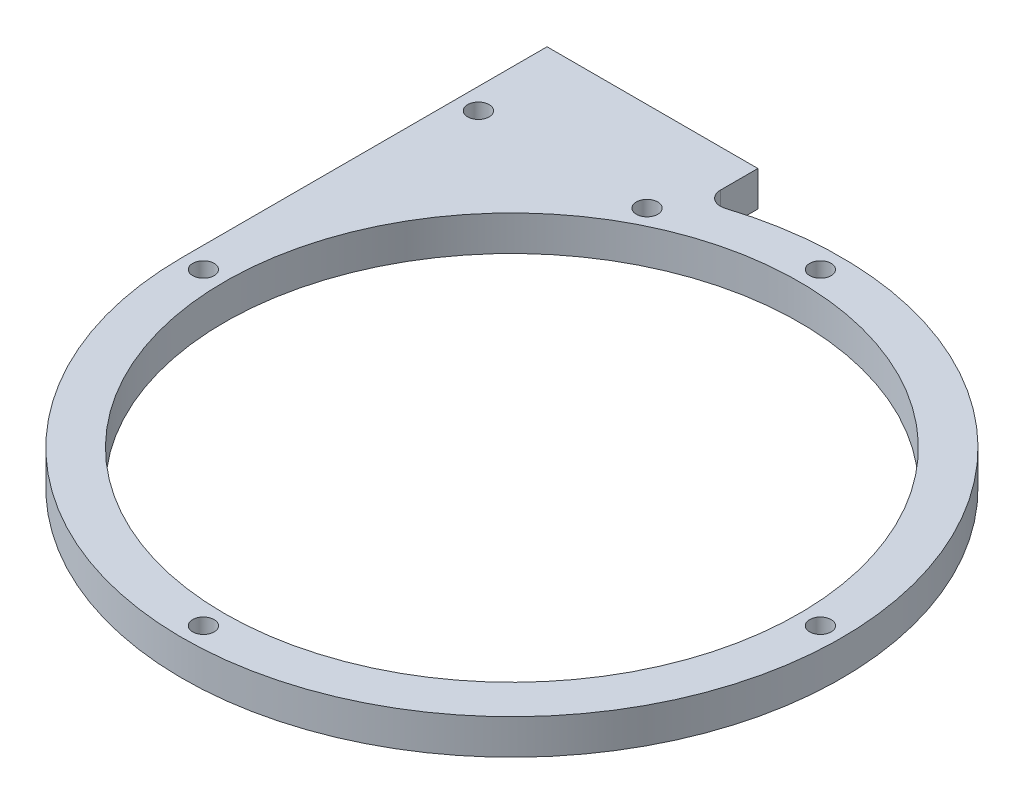
ISO-10303-21;
HEADER;
FILE_DESCRIPTION(('STEP AP214'),'2;1');
FILE_NAME('part.step','',(''),(''),'','','');
FILE_SCHEMA(('AUTOMOTIVE_DESIGN { 1 0 10303 214 1 1 1 1 }'));
ENDSEC;
DATA;
#1=APPLICATION_CONTEXT('core data for automotive mechanical design processes');
#2=APPLICATION_PROTOCOL_DEFINITION('international standard','automotive_design',2000,#1);
#3=PRODUCT_CONTEXT('',#1,'mechanical');
#4=PRODUCT('Part','Part','',(#3));
#5=PRODUCT_RELATED_PRODUCT_CATEGORY('part','',(#4));
#6=PRODUCT_DEFINITION_FORMATION('','',#4);
#7=PRODUCT_DEFINITION_CONTEXT('part definition',#1,'design');
#8=PRODUCT_DEFINITION('design','',#6,#7);
#9=PRODUCT_DEFINITION_SHAPE('','',#8);
#10=(LENGTH_UNIT() NAMED_UNIT(*) SI_UNIT(.MILLI.,.METRE.));
#11=(NAMED_UNIT(*) PLANE_ANGLE_UNIT() SI_UNIT($,.RADIAN.));
#12=(NAMED_UNIT(*) SI_UNIT($,.STERADIAN.) SOLID_ANGLE_UNIT());
#13=UNCERTAINTY_MEASURE_WITH_UNIT(LENGTH_MEASURE(1.E-05),#10,'distance_accuracy_value','');
#14=(GEOMETRIC_REPRESENTATION_CONTEXT(3) GLOBAL_UNCERTAINTY_ASSIGNED_CONTEXT((#13)) GLOBAL_UNIT_ASSIGNED_CONTEXT((#10,
#11,#12)) REPRESENTATION_CONTEXT('',''));
#15=CARTESIAN_POINT('',(0.,0.,0.));
#16=DIRECTION('',(0.,0.,1.));
#17=DIRECTION('',(1.,0.,0.));
#18=AXIS2_PLACEMENT_3D('',#15,#16,#17);
#19=CARTESIAN_POINT('',(0.,5.,0.));
#20=DIRECTION('',(0.,1.,0.));
#21=DIRECTION('',(0.,0.,1.));
#22=AXIS2_PLACEMENT_3D('',#19,#20,#21);
#23=PLANE('',#22);
#24=CARTESIAN_POINT('',(-43.9,5.,0.));
#25=DIRECTION('',(0.,1.,0.));
#26=DIRECTION('',(0.,0.,1.));
#27=AXIS2_PLACEMENT_3D('',#24,#25,#26);
#28=CIRCLE('',#27,1.525);
#29=CARTESIAN_POINT('',(-43.9,5.,1.525));
#30=VERTEX_POINT('',#29);
#31=EDGE_CURVE('E122',#30,#30,#28,.T.);
#32=ORIENTED_EDGE('',*,*,#31,.F.);
#33=EDGE_LOOP('',(#32));
#34=FACE_BOUND('',#33,.T.);
#35=CARTESIAN_POINT('',(43.9,5.,0.));
#36=DIRECTION('',(0.,1.,0.));
#37=DIRECTION('',(0.,0.,1.));
#38=AXIS2_PLACEMENT_3D('',#35,#36,#37);
#39=CIRCLE('',#38,1.525);
#40=CARTESIAN_POINT('',(43.9,5.,1.52500000000001));
#41=VERTEX_POINT('',#40);
#42=EDGE_CURVE('E135',#41,#41,#39,.T.);
#43=ORIENTED_EDGE('',*,*,#42,.F.);
#44=EDGE_LOOP('',(#43));
#45=FACE_BOUND('',#44,.T.);
#46=CARTESIAN_POINT('',(-19.9,5.,-39.1305507244659));
#47=DIRECTION('',(0.,1.,0.));
#48=DIRECTION('',(0.,0.,1.));
#49=AXIS2_PLACEMENT_3D('',#46,#47,#48);
#50=CIRCLE('',#49,1.525);
#51=CARTESIAN_POINT('',(-19.9,5.,-37.6055507244659));
#52=VERTEX_POINT('',#51);
#53=EDGE_CURVE('E143',#52,#52,#50,.T.);
#54=ORIENTED_EDGE('',*,*,#53,.F.);
#55=EDGE_LOOP('',(#54));
#56=FACE_BOUND('',#55,.T.);
#57=CARTESIAN_POINT('',(0.,5.,0.));
#58=DIRECTION('',(0.,1.,0.));
#59=DIRECTION('',(0.,0.,1.));
#60=AXIS2_PLACEMENT_3D('',#57,#58,#59);
#61=CIRCLE('',#60,46.9);
#62=CARTESIAN_POINT('',(-46.9,5.,0.));
#63=VERTEX_POINT('',#62);
#64=CARTESIAN_POINT('',(-14.2905930470348,5.,-44.6697766992856));
#65=VERTEX_POINT('',#64);
#66=EDGE_CURVE('E159',#63,#65,#61,.T.);
#67=ORIENTED_EDGE('',*,*,#66,.T.);
#68=CARTESIAN_POINT('',(-14.9,5.,-46.5746712280398));
#69=DIRECTION('',(0.,-1.,0.));
#70=DIRECTION('',(0.,0.,1.));
#71=AXIS2_PLACEMENT_3D('',#68,#69,#70);
#72=CIRCLE('',#71,2.00000000000001);
#73=CARTESIAN_POINT('',(-16.9,5.,-46.5746712280398));
#74=VERTEX_POINT('',#73);
#75=EDGE_CURVE('E79',#65,#74,#72,.T.);
#76=ORIENTED_EDGE('',*,*,#75,.T.);
#77=DIRECTION('',(0.,0.,-1.));
#78=VECTOR('',#77,1.);
#79=CARTESIAN_POINT('',(-16.9,5.,-46.9));
#80=LINE('',#79,#78);
#81=CARTESIAN_POINT('',(-16.9,5.,-51.9));
#82=VERTEX_POINT('',#81);
#83=EDGE_CURVE('E87',#74,#82,#80,.T.);
#84=ORIENTED_EDGE('',*,*,#83,.T.);
#85=DIRECTION('',(-1.,0.,0.));
#86=VECTOR('',#85,1.);
#87=CARTESIAN_POINT('',(-46.9,5.,-51.9));
#88=LINE('',#87,#86);
#89=CARTESIAN_POINT('',(-46.9,5.,-51.9));
#90=VERTEX_POINT('',#89);
#91=EDGE_CURVE('E95',#82,#90,#88,.T.);
#92=ORIENTED_EDGE('',*,*,#91,.T.);
#93=DIRECTION('',(0.,0.,1.));
#94=VECTOR('',#93,1.);
#95=CARTESIAN_POINT('',(-46.9,5.,0.));
#96=LINE('',#95,#94);
#97=EDGE_CURVE('E57',#90,#63,#96,.T.);
#98=ORIENTED_EDGE('',*,*,#97,.T.);
#99=EDGE_LOOP('',(#67,#76,#84,#92,#98));
#100=FACE_BOUND('',#99,.T.);
#101=CARTESIAN_POINT('',(0.,5.,0.));
#102=DIRECTION('',(0.,1.,0.));
#103=DIRECTION('',(0.,0.,1.));
#104=AXIS2_PLACEMENT_3D('',#101,#102,#103);
#105=CIRCLE('',#104,40.9);
#106=CARTESIAN_POINT('',(0.,5.,40.9));
#107=VERTEX_POINT('',#106);
#108=EDGE_CURVE('E154',#107,#107,#105,.T.);
#109=ORIENTED_EDGE('',*,*,#108,.F.);
#110=EDGE_LOOP('',(#109));
#111=FACE_BOUND('',#110,.T.);
#112=CARTESIAN_POINT('',(0.,5.,-43.9));
#113=DIRECTION('',(0.,1.,0.));
#114=DIRECTION('',(0.,0.,1.));
#115=AXIS2_PLACEMENT_3D('',#112,#113,#114);
#116=CIRCLE('',#115,1.525);
#117=CARTESIAN_POINT('',(0.,5.,-42.375));
#118=VERTEX_POINT('',#117);
#119=EDGE_CURVE('E140',#118,#118,#116,.T.);
#120=ORIENTED_EDGE('',*,*,#119,.F.);
#121=EDGE_LOOP('',(#120));
#122=FACE_BOUND('',#121,.T.);
#123=CARTESIAN_POINT('',(0.,5.,43.9));
#124=DIRECTION('',(0.,1.,0.));
#125=DIRECTION('',(0.,0.,1.));
#126=AXIS2_PLACEMENT_3D('',#123,#124,#125);
#127=CIRCLE('',#126,1.525);
#128=CARTESIAN_POINT('',(0.,5.,45.425));
#129=VERTEX_POINT('',#128);
#130=EDGE_CURVE('E130',#129,#129,#127,.T.);
#131=ORIENTED_EDGE('',*,*,#130,.F.);
#132=EDGE_LOOP('',(#131));
#133=FACE_BOUND('',#132,.T.);
#134=CARTESIAN_POINT('',(-43.9,5.,-39.1305507244659));
#135=DIRECTION('',(0.,1.,0.));
#136=DIRECTION('',(0.,0.,1.));
#137=AXIS2_PLACEMENT_3D('',#134,#135,#136);
#138=CIRCLE('',#137,1.525);
#139=CARTESIAN_POINT('',(-43.9,5.,-37.6055507244659));
#140=VERTEX_POINT('',#139);
#141=EDGE_CURVE('E114',#140,#140,#138,.T.);
#142=ORIENTED_EDGE('',*,*,#141,.F.);
#143=EDGE_LOOP('',(#142));
#144=FACE_BOUND('',#143,.T.);
#145=ADVANCED_FACE('F39',(#34,#45,#56,#100,#111,#122,#133,#144),#23,.T.);
#146=CARTESIAN_POINT('',(0.,0.,0.));
#147=DIRECTION('',(0.,1.,0.));
#148=DIRECTION('',(0.,0.,1.));
#149=AXIS2_PLACEMENT_3D('',#146,#147,#148);
#150=PLANE('',#149);
#151=CARTESIAN_POINT('',(0.,0.,0.));
#152=DIRECTION('',(0.,1.,0.));
#153=DIRECTION('',(0.,0.,1.));
#154=AXIS2_PLACEMENT_3D('',#151,#152,#153);
#155=CIRCLE('',#154,46.9);
#156=CARTESIAN_POINT('',(-46.9,0.,0.));
#157=VERTEX_POINT('',#156);
#158=CARTESIAN_POINT('',(-14.2905930470348,0.,-44.6697766992856));
#159=VERTEX_POINT('',#158);
#160=EDGE_CURVE('E153',#157,#159,#155,.T.);
#161=ORIENTED_EDGE('',*,*,#160,.F.);
#162=DIRECTION('',(0.,0.,1.));
#163=VECTOR('',#162,1.);
#164=CARTESIAN_POINT('',(-46.9,0.,0.));
#165=LINE('',#164,#163);
#166=CARTESIAN_POINT('',(-46.9,0.,-51.9));
#167=VERTEX_POINT('',#166);
#168=EDGE_CURVE('E77',#167,#157,#165,.T.);
#169=ORIENTED_EDGE('',*,*,#168,.F.);
#170=DIRECTION('',(-1.,0.,0.));
#171=VECTOR('',#170,1.);
#172=CARTESIAN_POINT('',(-46.9,0.,-51.9));
#173=LINE('',#172,#171);
#174=CARTESIAN_POINT('',(-16.9,0.,-51.9));
#175=VERTEX_POINT('',#174);
#176=EDGE_CURVE('E109',#175,#167,#173,.T.);
#177=ORIENTED_EDGE('',*,*,#176,.F.);
#178=DIRECTION('',(0.,0.,-1.));
#179=VECTOR('',#178,1.);
#180=CARTESIAN_POINT('',(-16.9,0.,-46.9));
#181=LINE('',#180,#179);
#182=CARTESIAN_POINT('',(-16.9,0.,-46.5746712280398));
#183=VERTEX_POINT('',#182);
#184=EDGE_CURVE('E105',#183,#175,#181,.T.);
#185=ORIENTED_EDGE('',*,*,#184,.F.);
#186=CARTESIAN_POINT('',(-14.9,0.,-46.5746712280398));
#187=DIRECTION('',(0.,-1.,0.));
#188=DIRECTION('',(0.,0.,1.));
#189=AXIS2_PLACEMENT_3D('',#186,#187,#188);
#190=CIRCLE('',#189,2.00000000000001);
#191=EDGE_CURVE('E67',#159,#183,#190,.T.);
#192=ORIENTED_EDGE('',*,*,#191,.F.);
#193=EDGE_LOOP('',(#161,#169,#177,#185,#192));
#194=FACE_BOUND('',#193,.T.);
#195=CARTESIAN_POINT('',(0.,0.,0.));
#196=DIRECTION('',(0.,1.,0.));
#197=DIRECTION('',(0.,0.,1.));
#198=AXIS2_PLACEMENT_3D('',#195,#196,#197);
#199=CIRCLE('',#198,40.9);
#200=CARTESIAN_POINT('',(0.,0.,40.9));
#201=VERTEX_POINT('',#200);
#202=EDGE_CURVE('E149',#201,#201,#199,.T.);
#203=ORIENTED_EDGE('',*,*,#202,.T.);
#204=EDGE_LOOP('',(#203));
#205=FACE_BOUND('',#204,.T.);
#206=CARTESIAN_POINT('',(-19.9,0.,-39.1305507244659));
#207=DIRECTION('',(0.,1.,0.));
#208=DIRECTION('',(0.,0.,1.));
#209=AXIS2_PLACEMENT_3D('',#206,#207,#208);
#210=CIRCLE('',#209,1.525);
#211=CARTESIAN_POINT('',(-19.9,0.,-37.6055507244659));
#212=VERTEX_POINT('',#211);
#213=EDGE_CURVE('E145',#212,#212,#210,.T.);
#214=ORIENTED_EDGE('',*,*,#213,.T.);
#215=EDGE_LOOP('',(#214));
#216=FACE_BOUND('',#215,.T.);
#217=CARTESIAN_POINT('',(0.,0.,-43.9));
#218=DIRECTION('',(0.,1.,0.));
#219=DIRECTION('',(0.,0.,1.));
#220=AXIS2_PLACEMENT_3D('',#217,#218,#219);
#221=CIRCLE('',#220,1.525);
#222=CARTESIAN_POINT('',(0.,0.,-42.375));
#223=VERTEX_POINT('',#222);
#224=EDGE_CURVE('E138',#223,#223,#221,.T.);
#225=ORIENTED_EDGE('',*,*,#224,.T.);
#226=EDGE_LOOP('',(#225));
#227=FACE_BOUND('',#226,.T.);
#228=CARTESIAN_POINT('',(43.9,0.,0.));
#229=DIRECTION('',(0.,1.,0.));
#230=DIRECTION('',(0.,0.,1.));
#231=AXIS2_PLACEMENT_3D('',#228,#229,#230);
#232=CIRCLE('',#231,1.525);
#233=CARTESIAN_POINT('',(43.9,0.,1.52500000000001));
#234=VERTEX_POINT('',#233);
#235=EDGE_CURVE('E128',#234,#234,#232,.T.);
#236=ORIENTED_EDGE('',*,*,#235,.T.);
#237=EDGE_LOOP('',(#236));
#238=FACE_BOUND('',#237,.T.);
#239=CARTESIAN_POINT('',(0.,0.,43.9));
#240=DIRECTION('',(0.,1.,0.));
#241=DIRECTION('',(0.,0.,1.));
#242=AXIS2_PLACEMENT_3D('',#239,#240,#241);
#243=CIRCLE('',#242,1.525);
#244=CARTESIAN_POINT('',(0.,0.,45.425));
#245=VERTEX_POINT('',#244);
#246=EDGE_CURVE('E121',#245,#245,#243,.T.);
#247=ORIENTED_EDGE('',*,*,#246,.T.);
#248=EDGE_LOOP('',(#247));
#249=FACE_BOUND('',#248,.T.);
#250=CARTESIAN_POINT('',(-43.9,0.,0.));
#251=DIRECTION('',(0.,1.,0.));
#252=DIRECTION('',(0.,0.,1.));
#253=AXIS2_PLACEMENT_3D('',#250,#251,#252);
#254=CIRCLE('',#253,1.525);
#255=CARTESIAN_POINT('',(-43.9,0.,1.525));
#256=VERTEX_POINT('',#255);
#257=EDGE_CURVE('E117',#256,#256,#254,.T.);
#258=ORIENTED_EDGE('',*,*,#257,.T.);
#259=EDGE_LOOP('',(#258));
#260=FACE_BOUND('',#259,.T.);
#261=CARTESIAN_POINT('',(-43.9,0.,-39.1305507244659));
#262=DIRECTION('',(0.,1.,0.));
#263=DIRECTION('',(0.,0.,1.));
#264=AXIS2_PLACEMENT_3D('',#261,#262,#263);
#265=CIRCLE('',#264,1.525);
#266=CARTESIAN_POINT('',(-43.9,0.,-37.6055507244659));
#267=VERTEX_POINT('',#266);
#268=EDGE_CURVE('E106',#267,#267,#265,.T.);
#269=ORIENTED_EDGE('',*,*,#268,.T.);
#270=EDGE_LOOP('',(#269));
#271=FACE_BOUND('',#270,.T.);
#272=ADVANCED_FACE('F169',(#194,#205,#216,#227,#238,#249,#260,#271),#150,.F.);
#273=CARTESIAN_POINT('',(0.,5.,0.));
#274=DIRECTION('',(0.,-1.,0.));
#275=DIRECTION('',(0.,0.,-1.));
#276=AXIS2_PLACEMENT_3D('',#273,#274,#275);
#277=CYLINDRICAL_SURFACE('',#276,46.9);
#278=ORIENTED_EDGE('',*,*,#160,.T.);
#279=DIRECTION('',(0.,-1.,0.));
#280=VECTOR('',#279,1.);
#281=CARTESIAN_POINT('',(-14.2905930470348,5.,-44.6697766992856));
#282=LINE('',#281,#280);
#283=EDGE_CURVE('E11',#65,#159,#282,.T.);
#284=ORIENTED_EDGE('',*,*,#283,.F.);
#285=ORIENTED_EDGE('',*,*,#66,.F.);
#286=DIRECTION('',(0.,-1.,0.));
#287=VECTOR('',#286,1.);
#288=CARTESIAN_POINT('',(-46.9,5.,0.));
#289=LINE('',#288,#287);
#290=EDGE_CURVE('E163',#63,#157,#289,.T.);
#291=ORIENTED_EDGE('',*,*,#290,.T.);
#292=EDGE_LOOP('',(#278,#284,#285,#291));
#293=FACE_BOUND('',#292,.T.);
#294=ADVANCED_FACE('F41',(#293),#277,.T.);
#295=CARTESIAN_POINT('',(-14.9,5.,-46.5746712280398));
#296=DIRECTION('',(0.,-1.,0.));
#297=DIRECTION('',(0.,0.,-1.));
#298=AXIS2_PLACEMENT_3D('',#295,#296,#297);
#299=CYLINDRICAL_SURFACE('',#298,2.00000000000001);
#300=ORIENTED_EDGE('',*,*,#191,.T.);
#301=DIRECTION('',(0.,-1.,0.));
#302=VECTOR('',#301,1.);
#303=CARTESIAN_POINT('',(-16.9,5.,-46.5746712280398));
#304=LINE('',#303,#302);
#305=EDGE_CURVE('E48',#74,#183,#304,.T.);
#306=ORIENTED_EDGE('',*,*,#305,.F.);
#307=ORIENTED_EDGE('',*,*,#75,.F.);
#308=ORIENTED_EDGE('',*,*,#283,.T.);
#309=EDGE_LOOP('',(#300,#306,#307,#308));
#310=FACE_BOUND('',#309,.T.);
#311=ADVANCED_FACE('F174',(#310),#299,.F.);
#312=CARTESIAN_POINT('',(-16.9,5.,-46.9));
#313=DIRECTION('',(-1.,0.,0.));
#314=DIRECTION('',(0.,0.,1.));
#315=AXIS2_PLACEMENT_3D('',#312,#313,#314);
#316=PLANE('',#315);
#317=ORIENTED_EDGE('',*,*,#184,.T.);
#318=DIRECTION('',(0.,-1.,0.));
#319=VECTOR('',#318,1.);
#320=CARTESIAN_POINT('',(-16.9,5.,-51.9));
#321=LINE('',#320,#319);
#322=EDGE_CURVE('E100',#82,#175,#321,.T.);
#323=ORIENTED_EDGE('',*,*,#322,.F.);
#324=ORIENTED_EDGE('',*,*,#83,.F.);
#325=ORIENTED_EDGE('',*,*,#305,.T.);
#326=EDGE_LOOP('',(#317,#323,#324,#325));
#327=FACE_BOUND('',#326,.T.);
#328=ADVANCED_FACE('F99',(#327),#316,.F.);
#329=CARTESIAN_POINT('',(-46.9,5.,0.));
#330=DIRECTION('',(1.,0.,0.));
#331=DIRECTION('',(0.,0.,-1.));
#332=AXIS2_PLACEMENT_3D('',#329,#330,#331);
#333=PLANE('',#332);
#334=ORIENTED_EDGE('',*,*,#168,.T.);
#335=ORIENTED_EDGE('',*,*,#290,.F.);
#336=ORIENTED_EDGE('',*,*,#97,.F.);
#337=DIRECTION('',(0.,-1.,0.));
#338=VECTOR('',#337,1.);
#339=CARTESIAN_POINT('',(-46.9,5.,-51.9));
#340=LINE('',#339,#338);
#341=EDGE_CURVE('E110',#90,#167,#340,.T.);
#342=ORIENTED_EDGE('',*,*,#341,.T.);
#343=EDGE_LOOP('',(#334,#335,#336,#342));
#344=FACE_BOUND('',#343,.T.);
#345=ADVANCED_FACE('F171',(#344),#333,.F.);
#346=CARTESIAN_POINT('',(0.,5.,0.));
#347=DIRECTION('',(0.,-1.,0.));
#348=DIRECTION('',(0.,0.,-1.));
#349=AXIS2_PLACEMENT_3D('',#346,#347,#348);
#350=CYLINDRICAL_SURFACE('',#349,40.9);
#351=ORIENTED_EDGE('',*,*,#108,.T.);
#352=EDGE_LOOP('',(#351));
#353=FACE_BOUND('',#352,.T.);
#354=ORIENTED_EDGE('',*,*,#202,.F.);
#355=EDGE_LOOP('',(#354));
#356=FACE_BOUND('',#355,.T.);
#357=ADVANCED_FACE('F191',(#353,#356),#350,.F.);
#358=CARTESIAN_POINT('',(-19.9,5.,-39.1305507244659));
#359=DIRECTION('',(0.,-1.,0.));
#360=DIRECTION('',(0.,0.,-1.));
#361=AXIS2_PLACEMENT_3D('',#358,#359,#360);
#362=CYLINDRICAL_SURFACE('',#361,1.525);
#363=ORIENTED_EDGE('',*,*,#53,.T.);
#364=EDGE_LOOP('',(#363));
#365=FACE_BOUND('',#364,.T.);
#366=ORIENTED_EDGE('',*,*,#213,.F.);
#367=EDGE_LOOP('',(#366));
#368=FACE_BOUND('',#367,.T.);
#369=ADVANCED_FACE('F203',(#365,#368),#362,.F.);
#370=CARTESIAN_POINT('',(0.,5.,-43.9));
#371=DIRECTION('',(0.,-1.,0.));
#372=DIRECTION('',(0.,0.,-1.));
#373=AXIS2_PLACEMENT_3D('',#370,#371,#372);
#374=CYLINDRICAL_SURFACE('',#373,1.525);
#375=ORIENTED_EDGE('',*,*,#119,.T.);
#376=EDGE_LOOP('',(#375));
#377=FACE_BOUND('',#376,.T.);
#378=ORIENTED_EDGE('',*,*,#224,.F.);
#379=EDGE_LOOP('',(#378));
#380=FACE_BOUND('',#379,.T.);
#381=ADVANCED_FACE('F207',(#377,#380),#374,.F.);
#382=CARTESIAN_POINT('',(43.9,5.,0.));
#383=DIRECTION('',(0.,-1.,0.));
#384=DIRECTION('',(0.,0.,-1.));
#385=AXIS2_PLACEMENT_3D('',#382,#383,#384);
#386=CYLINDRICAL_SURFACE('',#385,1.525);
#387=ORIENTED_EDGE('',*,*,#42,.T.);
#388=EDGE_LOOP('',(#387));
#389=FACE_BOUND('',#388,.T.);
#390=ORIENTED_EDGE('',*,*,#235,.F.);
#391=EDGE_LOOP('',(#390));
#392=FACE_BOUND('',#391,.T.);
#393=ADVANCED_FACE('F238',(#389,#392),#386,.F.);
#394=CARTESIAN_POINT('',(0.,5.,43.9));
#395=DIRECTION('',(0.,-1.,0.));
#396=DIRECTION('',(0.,0.,-1.));
#397=AXIS2_PLACEMENT_3D('',#394,#395,#396);
#398=CYLINDRICAL_SURFACE('',#397,1.525);
#399=ORIENTED_EDGE('',*,*,#130,.T.);
#400=EDGE_LOOP('',(#399));
#401=FACE_BOUND('',#400,.T.);
#402=ORIENTED_EDGE('',*,*,#246,.F.);
#403=EDGE_LOOP('',(#402));
#404=FACE_BOUND('',#403,.T.);
#405=ADVANCED_FACE('F235',(#401,#404),#398,.F.);
#406=CARTESIAN_POINT('',(-43.9,5.,0.));
#407=DIRECTION('',(0.,-1.,0.));
#408=DIRECTION('',(0.,0.,-1.));
#409=AXIS2_PLACEMENT_3D('',#406,#407,#408);
#410=CYLINDRICAL_SURFACE('',#409,1.525);
#411=ORIENTED_EDGE('',*,*,#31,.T.);
#412=EDGE_LOOP('',(#411));
#413=FACE_BOUND('',#412,.T.);
#414=ORIENTED_EDGE('',*,*,#257,.F.);
#415=EDGE_LOOP('',(#414));
#416=FACE_BOUND('',#415,.T.);
#417=ADVANCED_FACE('F221',(#413,#416),#410,.F.);
#418=CARTESIAN_POINT('',(-43.9,5.,-39.1305507244659));
#419=DIRECTION('',(0.,-1.,0.));
#420=DIRECTION('',(0.,0.,-1.));
#421=AXIS2_PLACEMENT_3D('',#418,#419,#420);
#422=CYLINDRICAL_SURFACE('',#421,1.525);
#423=ORIENTED_EDGE('',*,*,#141,.T.);
#424=EDGE_LOOP('',(#423));
#425=FACE_BOUND('',#424,.T.);
#426=ORIENTED_EDGE('',*,*,#268,.F.);
#427=EDGE_LOOP('',(#426));
#428=FACE_BOUND('',#427,.T.);
#429=ADVANCED_FACE('F225',(#425,#428),#422,.F.);
#430=CARTESIAN_POINT('',(-46.9,5.,-51.9));
#431=DIRECTION('',(0.,0.,1.));
#432=DIRECTION('',(1.,0.,0.));
#433=AXIS2_PLACEMENT_3D('',#430,#431,#432);
#434=PLANE('',#433);
#435=ORIENTED_EDGE('',*,*,#176,.T.);
#436=ORIENTED_EDGE('',*,*,#341,.F.);
#437=ORIENTED_EDGE('',*,*,#91,.F.);
#438=ORIENTED_EDGE('',*,*,#322,.T.);
#439=EDGE_LOOP('',(#435,#436,#437,#438));
#440=FACE_BOUND('',#439,.T.);
#441=ADVANCED_FACE('F107',(#440),#434,.F.);
#442=CLOSED_SHELL('',(#145,#272,#294,#311,#328,#345,#357,#369,#381,#393,#405,#417,#429,#441));
#443=MANIFOLD_SOLID_BREP('B2',#442);
#444=ADVANCED_BREP_SHAPE_REPRESENTATION('',(#18,#443),#14);
#445=SHAPE_DEFINITION_REPRESENTATION(#9,#444);
ENDSEC;
END-ISO-10303-21;
